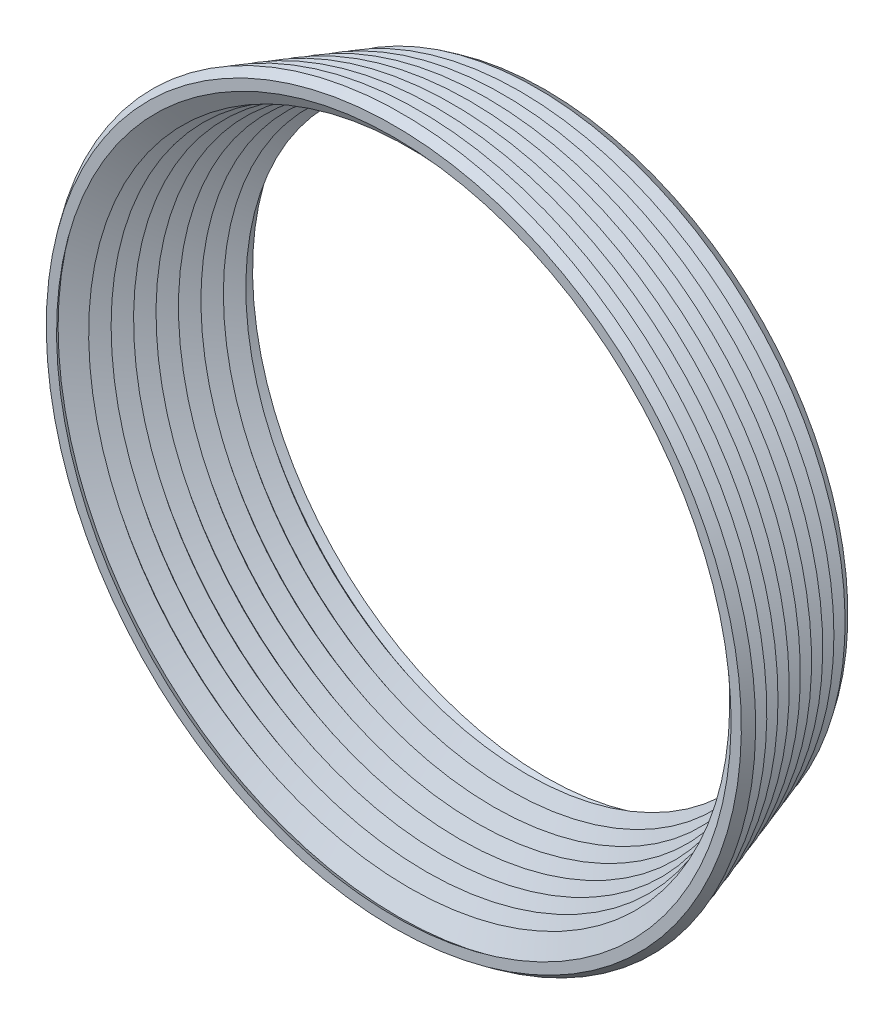
ISO-10303-21;
HEADER;
FILE_DESCRIPTION(('STEP AP214'),'2;1');
FILE_NAME('part.step','',(''),(''),'','','');
FILE_SCHEMA(('AUTOMOTIVE_DESIGN { 1 0 10303 214 1 1 1 1 }'));
ENDSEC;
DATA;
#1=APPLICATION_CONTEXT('core data for automotive mechanical design processes');
#2=APPLICATION_PROTOCOL_DEFINITION('international standard','automotive_design',2000,#1);
#3=PRODUCT_CONTEXT('',#1,'mechanical');
#4=PRODUCT('Part','Part','',(#3));
#5=PRODUCT_RELATED_PRODUCT_CATEGORY('part','',(#4));
#6=PRODUCT_DEFINITION_FORMATION('','',#4);
#7=PRODUCT_DEFINITION_CONTEXT('part definition',#1,'design');
#8=PRODUCT_DEFINITION('design','',#6,#7);
#9=PRODUCT_DEFINITION_SHAPE('','',#8);
#10=(LENGTH_UNIT() NAMED_UNIT(*) SI_UNIT(.MILLI.,.METRE.));
#11=(NAMED_UNIT(*) PLANE_ANGLE_UNIT() SI_UNIT($,.RADIAN.));
#12=(NAMED_UNIT(*) SI_UNIT($,.STERADIAN.) SOLID_ANGLE_UNIT());
#13=UNCERTAINTY_MEASURE_WITH_UNIT(LENGTH_MEASURE(1.E-05),#10,'distance_accuracy_value','');
#14=(GEOMETRIC_REPRESENTATION_CONTEXT(3) GLOBAL_UNCERTAINTY_ASSIGNED_CONTEXT((#13)) GLOBAL_UNIT_ASSIGNED_CONTEXT((#10,
#11,#12)) REPRESENTATION_CONTEXT('',''));
#15=CARTESIAN_POINT('',(0.,0.,0.));
#16=DIRECTION('',(0.,0.,1.));
#17=DIRECTION('',(1.,0.,0.));
#18=AXIS2_PLACEMENT_3D('',#15,#16,#17);
#19=CARTESIAN_POINT('',(0.,41.33,9.));
#20=DIRECTION('',(0.,0.,-1.));
#21=DIRECTION('',(0.,1.,0.));
#22=AXIS2_PLACEMENT_3D('',#19,#20,#21);
#23=PLANE('',#22);
#24=CARTESIAN_POINT('',(0.,0.,9.));
#25=DIRECTION('',(0.,0.,-1.));
#26=DIRECTION('',(0.,1.,0.));
#27=AXIS2_PLACEMENT_3D('',#24,#25,#26);
#28=CIRCLE('',#27,40.1093444384266);
#29=CARTESIAN_POINT('',(0.,40.1093444384266,9.));
#30=VERTEX_POINT('',#29);
#31=EDGE_CURVE('E95',#30,#30,#28,.F.);
#32=ORIENTED_EDGE('',*,*,#31,.F.);
#33=EDGE_LOOP('',(#32));
#34=FACE_BOUND('',#33,.T.);
#35=CARTESIAN_POINT('',(0.,0.,8.99999999999999));
#36=DIRECTION('',(0.,0.,1.));
#37=DIRECTION('',(0.,-1.,0.));
#38=AXIS2_PLACEMENT_3D('',#35,#36,#37);
#39=CIRCLE('',#38,41.33);
#40=CARTESIAN_POINT('',(0.,-41.33,8.99999999999999));
#41=VERTEX_POINT('',#40);
#42=EDGE_CURVE('E10',#41,#41,#39,.T.);
#43=ORIENTED_EDGE('',*,*,#42,.T.);
#44=EDGE_LOOP('',(#43));
#45=FACE_BOUND('',#44,.T.);
#46=ADVANCED_FACE('F31',(#34,#45),#23,.F.);
#47=CARTESIAN_POINT('',(0.,0.,7.99999999999999));
#48=DIRECTION('',(0.,0.,-1.));
#49=DIRECTION('',(0.,1.,0.));
#50=AXIS2_PLACEMENT_3D('',#47,#48,#49);
#51=CONICAL_SURFACE('',#50,42.03,0.61072596438919);
#52=ORIENTED_EDGE('',*,*,#42,.F.);
#53=EDGE_LOOP('',(#52));
#54=FACE_BOUND('',#53,.T.);
#55=CARTESIAN_POINT('',(0.,0.,7.99999999999999));
#56=DIRECTION('',(0.,0.,1.));
#57=DIRECTION('',(0.,-1.,0.));
#58=AXIS2_PLACEMENT_3D('',#55,#56,#57);
#59=CIRCLE('',#58,42.03);
#60=CARTESIAN_POINT('',(0.,-42.03,7.99999999999999));
#61=VERTEX_POINT('',#60);
#62=EDGE_CURVE('E37',#61,#61,#59,.T.);
#63=ORIENTED_EDGE('',*,*,#62,.T.);
#64=EDGE_LOOP('',(#63));
#65=FACE_BOUND('',#64,.T.);
#66=ADVANCED_FACE('F171',(#54,#65),#51,.T.);
#67=CARTESIAN_POINT('',(0.,0.,6.99999999999999));
#68=DIRECTION('',(0.,0.,1.));
#69=DIRECTION('',(0.,-1.,0.));
#70=AXIS2_PLACEMENT_3D('',#67,#68,#69);
#71=CONICAL_SURFACE('',#70,40.02,1.10914074703168);
#72=ORIENTED_EDGE('',*,*,#62,.F.);
#73=EDGE_LOOP('',(#72));
#74=FACE_BOUND('',#73,.T.);
#75=CARTESIAN_POINT('',(0.,0.,6.99999999999999));
#76=DIRECTION('',(0.,0.,1.));
#77=DIRECTION('',(0.,-1.,0.));
#78=AXIS2_PLACEMENT_3D('',#75,#76,#77);
#79=CIRCLE('',#78,40.02);
#80=CARTESIAN_POINT('',(0.,-40.02,6.99999999999999));
#81=VERTEX_POINT('',#80);
#82=EDGE_CURVE('E41',#81,#81,#79,.T.);
#83=ORIENTED_EDGE('',*,*,#82,.T.);
#84=EDGE_LOOP('',(#83));
#85=FACE_BOUND('',#84,.T.);
#86=ADVANCED_FACE('F176',(#74,#85),#71,.T.);
#87=CARTESIAN_POINT('',(0.,0.,5.99999999999999));
#88=DIRECTION('',(0.,0.,-1.));
#89=DIRECTION('',(0.,1.,0.));
#90=AXIS2_PLACEMENT_3D('',#87,#88,#89);
#91=CONICAL_SURFACE('',#90,41.36,0.929687557935191);
#92=ORIENTED_EDGE('',*,*,#82,.F.);
#93=EDGE_LOOP('',(#92));
#94=FACE_BOUND('',#93,.T.);
#95=CARTESIAN_POINT('',(0.,0.,5.99999999999999));
#96=DIRECTION('',(0.,0.,1.));
#97=DIRECTION('',(0.,-1.,0.));
#98=AXIS2_PLACEMENT_3D('',#95,#96,#97);
#99=CIRCLE('',#98,41.36);
#100=CARTESIAN_POINT('',(0.,-41.36,5.99999999999998));
#101=VERTEX_POINT('',#100);
#102=EDGE_CURVE('E45',#101,#101,#99,.T.);
#103=ORIENTED_EDGE('',*,*,#102,.T.);
#104=EDGE_LOOP('',(#103));
#105=FACE_BOUND('',#104,.T.);
#106=ADVANCED_FACE('F182',(#94,#105),#91,.T.);
#107=CARTESIAN_POINT('',(0.,0.,4.99999999999999));
#108=DIRECTION('',(0.,0.,1.));
#109=DIRECTION('',(0.,-1.,0.));
#110=AXIS2_PLACEMENT_3D('',#107,#108,#109);
#111=CONICAL_SURFACE('',#110,39.35,1.10914074703169);
#112=ORIENTED_EDGE('',*,*,#102,.F.);
#113=EDGE_LOOP('',(#112));
#114=FACE_BOUND('',#113,.T.);
#115=CARTESIAN_POINT('',(0.,0.,4.99999999999999));
#116=DIRECTION('',(0.,0.,1.));
#117=DIRECTION('',(0.,-1.,0.));
#118=AXIS2_PLACEMENT_3D('',#115,#116,#117);
#119=CIRCLE('',#118,39.35);
#120=CARTESIAN_POINT('',(0.,-39.35,4.99999999999999));
#121=VERTEX_POINT('',#120);
#122=EDGE_CURVE('E50',#121,#121,#119,.T.);
#123=ORIENTED_EDGE('',*,*,#122,.T.);
#124=EDGE_LOOP('',(#123));
#125=FACE_BOUND('',#124,.T.);
#126=ADVANCED_FACE('F188',(#114,#125),#111,.T.);
#127=CARTESIAN_POINT('',(0.,0.,3.99999999999999));
#128=DIRECTION('',(0.,0.,-1.));
#129=DIRECTION('',(0.,1.,0.));
#130=AXIS2_PLACEMENT_3D('',#127,#128,#129);
#131=CONICAL_SURFACE('',#130,40.69,0.929687557935191);
#132=ORIENTED_EDGE('',*,*,#122,.F.);
#133=EDGE_LOOP('',(#132));
#134=FACE_BOUND('',#133,.T.);
#135=CARTESIAN_POINT('',(0.,0.,3.99999999999999));
#136=DIRECTION('',(0.,0.,1.));
#137=DIRECTION('',(0.,-1.,0.));
#138=AXIS2_PLACEMENT_3D('',#135,#136,#137);
#139=CIRCLE('',#138,40.69);
#140=CARTESIAN_POINT('',(0.,-40.69,3.99999999999998));
#141=VERTEX_POINT('',#140);
#142=EDGE_CURVE('E53',#141,#141,#139,.T.);
#143=ORIENTED_EDGE('',*,*,#142,.T.);
#144=EDGE_LOOP('',(#143));
#145=FACE_BOUND('',#144,.T.);
#146=ADVANCED_FACE('F192',(#134,#145),#131,.T.);
#147=CARTESIAN_POINT('',(0.,0.,2.99999999999999));
#148=DIRECTION('',(0.,0.,1.));
#149=DIRECTION('',(0.,-1.,0.));
#150=AXIS2_PLACEMENT_3D('',#147,#148,#149);
#151=CONICAL_SURFACE('',#150,38.68,1.10914074703168);
#152=ORIENTED_EDGE('',*,*,#142,.F.);
#153=EDGE_LOOP('',(#152));
#154=FACE_BOUND('',#153,.T.);
#155=CARTESIAN_POINT('',(0.,0.,2.99999999999999));
#156=DIRECTION('',(0.,0.,1.));
#157=DIRECTION('',(0.,-1.,0.));
#158=AXIS2_PLACEMENT_3D('',#155,#156,#157);
#159=CIRCLE('',#158,38.68);
#160=CARTESIAN_POINT('',(0.,-38.68,2.99999999999998));
#161=VERTEX_POINT('',#160);
#162=EDGE_CURVE('E56',#161,#161,#159,.T.);
#163=ORIENTED_EDGE('',*,*,#162,.T.);
#164=EDGE_LOOP('',(#163));
#165=FACE_BOUND('',#164,.T.);
#166=ADVANCED_FACE('F196',(#154,#165),#151,.T.);
#167=CARTESIAN_POINT('',(0.,0.,1.99999999999999));
#168=DIRECTION('',(0.,0.,-1.));
#169=DIRECTION('',(0.,1.,0.));
#170=AXIS2_PLACEMENT_3D('',#167,#168,#169);
#171=CONICAL_SURFACE('',#170,40.02,0.929687557935192);
#172=ORIENTED_EDGE('',*,*,#162,.F.);
#173=EDGE_LOOP('',(#172));
#174=FACE_BOUND('',#173,.T.);
#175=CARTESIAN_POINT('',(0.,0.,1.99999999999999));
#176=DIRECTION('',(0.,0.,1.));
#177=DIRECTION('',(0.,-1.,0.));
#178=AXIS2_PLACEMENT_3D('',#175,#176,#177);
#179=CIRCLE('',#178,40.02);
#180=CARTESIAN_POINT('',(0.,-40.02,1.99999999999998));
#181=VERTEX_POINT('',#180);
#182=EDGE_CURVE('E59',#181,#181,#179,.T.);
#183=ORIENTED_EDGE('',*,*,#182,.T.);
#184=EDGE_LOOP('',(#183));
#185=FACE_BOUND('',#184,.T.);
#186=ADVANCED_FACE('F200',(#174,#185),#171,.T.);
#187=CARTESIAN_POINT('',(0.,0.,0.99999999999999));
#188=DIRECTION('',(0.,0.,1.));
#189=DIRECTION('',(0.,-1.,0.));
#190=AXIS2_PLACEMENT_3D('',#187,#188,#189);
#191=CONICAL_SURFACE('',#190,38.01,1.10914074703168);
#192=ORIENTED_EDGE('',*,*,#182,.F.);
#193=EDGE_LOOP('',(#192));
#194=FACE_BOUND('',#193,.T.);
#195=CARTESIAN_POINT('',(0.,0.,0.99999999999999));
#196=DIRECTION('',(0.,0.,1.));
#197=DIRECTION('',(0.,-1.,0.));
#198=AXIS2_PLACEMENT_3D('',#195,#196,#197);
#199=CIRCLE('',#198,38.01);
#200=CARTESIAN_POINT('',(0.,-38.01,0.999999999999984));
#201=VERTEX_POINT('',#200);
#202=EDGE_CURVE('E62',#201,#201,#199,.T.);
#203=ORIENTED_EDGE('',*,*,#202,.T.);
#204=EDGE_LOOP('',(#203));
#205=FACE_BOUND('',#204,.T.);
#206=ADVANCED_FACE('F204',(#194,#205),#191,.T.);
#207=CARTESIAN_POINT('',(0.,0.,0.));
#208=DIRECTION('',(0.,0.,-1.));
#209=DIRECTION('',(0.,1.,0.));
#210=AXIS2_PLACEMENT_3D('',#207,#208,#209);
#211=CONICAL_SURFACE('',#210,39.35,0.929687557935192);
#212=ORIENTED_EDGE('',*,*,#202,.F.);
#213=EDGE_LOOP('',(#212));
#214=FACE_BOUND('',#213,.T.);
#215=CARTESIAN_POINT('',(0.,0.,0.));
#216=DIRECTION('',(0.,0.,1.));
#217=DIRECTION('',(0.,-1.,0.));
#218=AXIS2_PLACEMENT_3D('',#215,#216,#217);
#219=CIRCLE('',#218,39.35);
#220=CARTESIAN_POINT('',(0.,-39.35,0.));
#221=VERTEX_POINT('',#220);
#222=EDGE_CURVE('E65',#221,#221,#219,.T.);
#223=ORIENTED_EDGE('',*,*,#222,.T.);
#224=EDGE_LOOP('',(#223));
#225=FACE_BOUND('',#224,.T.);
#226=ADVANCED_FACE('F208',(#214,#225),#211,.T.);
#227=CARTESIAN_POINT('',(0.,0.,-1.00000000000001));
#228=DIRECTION('',(0.,0.,1.));
#229=DIRECTION('',(0.,-1.,0.));
#230=AXIS2_PLACEMENT_3D('',#227,#228,#229);
#231=CONICAL_SURFACE('',#230,37.34,1.10914074703168);
#232=ORIENTED_EDGE('',*,*,#222,.F.);
#233=EDGE_LOOP('',(#232));
#234=FACE_BOUND('',#233,.T.);
#235=CARTESIAN_POINT('',(0.,0.,-1.00000000000001));
#236=DIRECTION('',(0.,0.,1.));
#237=DIRECTION('',(0.,-1.,0.));
#238=AXIS2_PLACEMENT_3D('',#235,#236,#237);
#239=CIRCLE('',#238,37.34);
#240=CARTESIAN_POINT('',(0.,-37.34,-1.00000000000002));
#241=VERTEX_POINT('',#240);
#242=EDGE_CURVE('E68',#241,#241,#239,.T.);
#243=ORIENTED_EDGE('',*,*,#242,.T.);
#244=EDGE_LOOP('',(#243));
#245=FACE_BOUND('',#244,.T.);
#246=ADVANCED_FACE('F212',(#234,#245),#231,.T.);
#247=CARTESIAN_POINT('',(0.,0.,-2.00000000000001));
#248=DIRECTION('',(0.,0.,-1.));
#249=DIRECTION('',(0.,1.,0.));
#250=AXIS2_PLACEMENT_3D('',#247,#248,#249);
#251=CONICAL_SURFACE('',#250,38.68,0.929687557935192);
#252=ORIENTED_EDGE('',*,*,#242,.F.);
#253=EDGE_LOOP('',(#252));
#254=FACE_BOUND('',#253,.T.);
#255=CARTESIAN_POINT('',(0.,0.,-2.00000000000001));
#256=DIRECTION('',(0.,0.,1.));
#257=DIRECTION('',(0.,-1.,0.));
#258=AXIS2_PLACEMENT_3D('',#255,#256,#257);
#259=CIRCLE('',#258,38.68);
#260=CARTESIAN_POINT('',(0.,-38.68,-2.00000000000002));
#261=VERTEX_POINT('',#260);
#262=EDGE_CURVE('E71',#261,#261,#259,.T.);
#263=ORIENTED_EDGE('',*,*,#262,.T.);
#264=EDGE_LOOP('',(#263));
#265=FACE_BOUND('',#264,.T.);
#266=ADVANCED_FACE('F216',(#254,#265),#251,.T.);
#267=CARTESIAN_POINT('',(0.,0.,-3.00000000000001));
#268=DIRECTION('',(0.,0.,1.));
#269=DIRECTION('',(0.,-1.,0.));
#270=AXIS2_PLACEMENT_3D('',#267,#268,#269);
#271=CONICAL_SURFACE('',#270,36.67,1.10914074703169);
#272=ORIENTED_EDGE('',*,*,#262,.F.);
#273=EDGE_LOOP('',(#272));
#274=FACE_BOUND('',#273,.T.);
#275=CARTESIAN_POINT('',(0.,0.,-3.00000000000001));
#276=DIRECTION('',(0.,0.,1.));
#277=DIRECTION('',(0.,-1.,0.));
#278=AXIS2_PLACEMENT_3D('',#275,#276,#277);
#279=CIRCLE('',#278,36.67);
#280=CARTESIAN_POINT('',(0.,-36.67,-3.00000000000001));
#281=VERTEX_POINT('',#280);
#282=EDGE_CURVE('E74',#281,#281,#279,.T.);
#283=ORIENTED_EDGE('',*,*,#282,.T.);
#284=EDGE_LOOP('',(#283));
#285=FACE_BOUND('',#284,.T.);
#286=ADVANCED_FACE('F220',(#274,#285),#271,.T.);
#287=CARTESIAN_POINT('',(0.,0.,-4.00000000000001));
#288=DIRECTION('',(0.,0.,-1.));
#289=DIRECTION('',(0.,1.,0.));
#290=AXIS2_PLACEMENT_3D('',#287,#288,#289);
#291=CONICAL_SURFACE('',#290,38.01,0.929687557935191);
#292=ORIENTED_EDGE('',*,*,#282,.F.);
#293=EDGE_LOOP('',(#292));
#294=FACE_BOUND('',#293,.T.);
#295=CARTESIAN_POINT('',(0.,0.,-4.00000000000001));
#296=DIRECTION('',(0.,0.,1.));
#297=DIRECTION('',(0.,-1.,0.));
#298=AXIS2_PLACEMENT_3D('',#295,#296,#297);
#299=CIRCLE('',#298,38.01);
#300=CARTESIAN_POINT('',(0.,-38.01,-4.00000000000002));
#301=VERTEX_POINT('',#300);
#302=EDGE_CURVE('E77',#301,#301,#299,.T.);
#303=ORIENTED_EDGE('',*,*,#302,.T.);
#304=EDGE_LOOP('',(#303));
#305=FACE_BOUND('',#304,.T.);
#306=ADVANCED_FACE('F224',(#294,#305),#291,.T.);
#307=CARTESIAN_POINT('',(0.,0.,-5.00000000000001));
#308=DIRECTION('',(0.,0.,1.));
#309=DIRECTION('',(0.,-1.,0.));
#310=AXIS2_PLACEMENT_3D('',#307,#308,#309);
#311=CONICAL_SURFACE('',#310,36.,1.10914074703169);
#312=ORIENTED_EDGE('',*,*,#302,.F.);
#313=EDGE_LOOP('',(#312));
#314=FACE_BOUND('',#313,.T.);
#315=CARTESIAN_POINT('',(0.,0.,-5.00000000000001));
#316=DIRECTION('',(0.,0.,1.));
#317=DIRECTION('',(0.,-1.,0.));
#318=AXIS2_PLACEMENT_3D('',#315,#316,#317);
#319=CIRCLE('',#318,36.);
#320=CARTESIAN_POINT('',(0.,-36.,-5.00000000000002));
#321=VERTEX_POINT('',#320);
#322=EDGE_CURVE('E80',#321,#321,#319,.T.);
#323=ORIENTED_EDGE('',*,*,#322,.T.);
#324=EDGE_LOOP('',(#323));
#325=FACE_BOUND('',#324,.T.);
#326=ADVANCED_FACE('F228',(#314,#325),#311,.T.);
#327=CARTESIAN_POINT('',(0.,0.,-6.00000000000001));
#328=DIRECTION('',(0.,0.,-1.));
#329=DIRECTION('',(0.,1.,0.));
#330=AXIS2_PLACEMENT_3D('',#327,#328,#329);
#331=CONICAL_SURFACE('',#330,37.34,0.929687557935191);
#332=ORIENTED_EDGE('',*,*,#322,.F.);
#333=EDGE_LOOP('',(#332));
#334=FACE_BOUND('',#333,.T.);
#335=CARTESIAN_POINT('',(0.,0.,-6.00000000000001));
#336=DIRECTION('',(0.,0.,1.));
#337=DIRECTION('',(0.,-1.,0.));
#338=AXIS2_PLACEMENT_3D('',#335,#336,#337);
#339=CIRCLE('',#338,37.34);
#340=CARTESIAN_POINT('',(0.,-37.34,-6.00000000000002));
#341=VERTEX_POINT('',#340);
#342=EDGE_CURVE('E83',#341,#341,#339,.T.);
#343=ORIENTED_EDGE('',*,*,#342,.T.);
#344=EDGE_LOOP('',(#343));
#345=FACE_BOUND('',#344,.T.);
#346=ADVANCED_FACE('F232',(#334,#345),#331,.T.);
#347=CARTESIAN_POINT('',(0.,0.,-7.00000000000001));
#348=DIRECTION('',(0.,0.,1.));
#349=DIRECTION('',(0.,-1.,0.));
#350=AXIS2_PLACEMENT_3D('',#347,#348,#349);
#351=CONICAL_SURFACE('',#350,35.33,1.10914074703169);
#352=ORIENTED_EDGE('',*,*,#342,.F.);
#353=EDGE_LOOP('',(#352));
#354=FACE_BOUND('',#353,.T.);
#355=CARTESIAN_POINT('',(0.,0.,-7.00000000000001));
#356=DIRECTION('',(0.,0.,1.));
#357=DIRECTION('',(0.,-1.,0.));
#358=AXIS2_PLACEMENT_3D('',#355,#356,#357);
#359=CIRCLE('',#358,35.33);
#360=CARTESIAN_POINT('',(0.,-35.33,-7.00000000000001));
#361=VERTEX_POINT('',#360);
#362=EDGE_CURVE('E86',#361,#361,#359,.T.);
#363=ORIENTED_EDGE('',*,*,#362,.T.);
#364=EDGE_LOOP('',(#363));
#365=FACE_BOUND('',#364,.T.);
#366=ADVANCED_FACE('F236',(#354,#365),#351,.T.);
#367=CARTESIAN_POINT('',(0.,0.,-8.00000000000001));
#368=DIRECTION('',(0.,0.,-1.));
#369=DIRECTION('',(0.,1.,0.));
#370=AXIS2_PLACEMENT_3D('',#367,#368,#369);
#371=CONICAL_SURFACE('',#370,36.67,0.929687557935191);
#372=ORIENTED_EDGE('',*,*,#362,.F.);
#373=EDGE_LOOP('',(#372));
#374=FACE_BOUND('',#373,.T.);
#375=CARTESIAN_POINT('',(0.,0.,-8.00000000000001));
#376=DIRECTION('',(0.,0.,1.));
#377=DIRECTION('',(0.,-1.,0.));
#378=AXIS2_PLACEMENT_3D('',#375,#376,#377);
#379=CIRCLE('',#378,36.67);
#380=CARTESIAN_POINT('',(0.,-36.67,-8.00000000000002));
#381=VERTEX_POINT('',#380);
#382=EDGE_CURVE('E89',#381,#381,#379,.T.);
#383=ORIENTED_EDGE('',*,*,#382,.T.);
#384=EDGE_LOOP('',(#383));
#385=FACE_BOUND('',#384,.T.);
#386=ADVANCED_FACE('F240',(#374,#385),#371,.T.);
#387=CARTESIAN_POINT('',(0.,0.,-9.00000000000001));
#388=DIRECTION('',(0.,0.,1.));
#389=DIRECTION('',(0.,-1.,0.));
#390=AXIS2_PLACEMENT_3D('',#387,#388,#389);
#391=CONICAL_SURFACE('',#390,36.,0.590306746935369);
#392=ORIENTED_EDGE('',*,*,#382,.F.);
#393=EDGE_LOOP('',(#392));
#394=FACE_BOUND('',#393,.T.);
#395=CARTESIAN_POINT('',(0.,0.,-9.00000000000001));
#396=DIRECTION('',(0.,0.,1.));
#397=DIRECTION('',(0.,-1.,0.));
#398=AXIS2_PLACEMENT_3D('',#395,#396,#397);
#399=CIRCLE('',#398,36.);
#400=CARTESIAN_POINT('',(0.,-36.,-9.00000000000002));
#401=VERTEX_POINT('',#400);
#402=EDGE_CURVE('E92',#401,#401,#399,.T.);
#403=ORIENTED_EDGE('',*,*,#402,.T.);
#404=EDGE_LOOP('',(#403));
#405=FACE_BOUND('',#404,.T.);
#406=ADVANCED_FACE('F167',(#394,#405),#391,.T.);
#407=CARTESIAN_POINT('',(0.,36.,-9.));
#408=DIRECTION('',(0.,0.,1.));
#409=DIRECTION('',(0.,-1.,0.));
#410=AXIS2_PLACEMENT_3D('',#407,#408,#409);
#411=PLANE('',#410);
#412=CARTESIAN_POINT('',(0.,0.,-9.00000000000001));
#413=DIRECTION('',(0.,0.,1.));
#414=DIRECTION('',(0.,-1.,0.));
#415=AXIS2_PLACEMENT_3D('',#412,#413,#414);
#416=CIRCLE('',#415,34.7962973789179);
#417=CARTESIAN_POINT('',(0.,-34.7962973789179,-9.00000000000001));
#418=VERTEX_POINT('',#417);
#419=EDGE_CURVE('E96',#418,#418,#416,.T.);
#420=ORIENTED_EDGE('',*,*,#419,.T.);
#421=EDGE_LOOP('',(#420));
#422=FACE_BOUND('',#421,.T.);
#423=ORIENTED_EDGE('',*,*,#402,.F.);
#424=EDGE_LOOP('',(#423));
#425=FACE_BOUND('',#424,.T.);
#426=ADVANCED_FACE('F158',(#422,#425),#411,.F.);
#427=CARTESIAN_POINT('',(0.,0.,7.42653765563668));
#428=DIRECTION('',(0.,0.,-1.));
#429=DIRECTION('',(0.,1.,0.));
#430=AXIS2_PLACEMENT_3D('',#427,#428,#429);
#431=CONICAL_SURFACE('',#430,41.2107680794809,0.61072596438919);
#432=ORIENTED_EDGE('',*,*,#31,.T.);
#433=EDGE_LOOP('',(#432));
#434=FACE_BOUND('',#433,.T.);
#435=CARTESIAN_POINT('',(0.,0.,8.37799304138402));
#436=DIRECTION('',(0.,0.,1.));
#437=DIRECTION('',(0.,-1.,0.));
#438=AXIS2_PLACEMENT_3D('',#435,#436,#437);
#439=CIRCLE('',#438,40.5447493094578);
#440=CARTESIAN_POINT('',(0.,-40.5447493094578,8.37799304138401));
#441=VERTEX_POINT('',#440);
#442=EDGE_CURVE('E102',#441,#441,#439,.T.);
#443=ORIENTED_EDGE('',*,*,#442,.F.);
#444=EDGE_LOOP('',(#443));
#445=FACE_BOUND('',#444,.T.);
#446=ADVANCED_FACE('F156',(#434,#445),#431,.F.);
#447=CARTESIAN_POINT('',(0.,0.,7.89531627834474));
#448=DIRECTION('',(0.,0.,1.));
#449=DIRECTION('',(0.,-1.,0.));
#450=AXIS2_PLACEMENT_3D('',#447,#448,#449);
#451=CONICAL_SURFACE('',#450,39.5745690157489,1.10914074703168);
#452=ORIENTED_EDGE('',*,*,#442,.T.);
#453=EDGE_LOOP('',(#452));
#454=FACE_BOUND('',#453,.T.);
#455=CARTESIAN_POINT('',(0.,0.,7.17104833404235));
#456=DIRECTION('',(0.,0.,1.));
#457=DIRECTION('',(0.,-1.,0.));
#458=AXIS2_PLACEMENT_3D('',#455,#456,#457);
#459=CIRCLE('',#458,38.1187904477011);
#460=CARTESIAN_POINT('',(0.,-38.1187904477011,7.17104833404234));
#461=VERTEX_POINT('',#460);
#462=EDGE_CURVE('E147',#461,#461,#459,.T.);
#463=ORIENTED_EDGE('',*,*,#462,.F.);
#464=EDGE_LOOP('',(#463));
#465=FACE_BOUND('',#464,.T.);
#466=ADVANCED_FACE('F153',(#454,#465),#451,.F.);
#467=CARTESIAN_POINT('',(0.,0.,5.1985668867241));
#468=DIRECTION('',(0.,0.,-1.));
#469=DIRECTION('',(0.,1.,0.));
#470=AXIS2_PLACEMENT_3D('',#467,#468,#469);
#471=CONICAL_SURFACE('',#470,40.7619155871075,0.929687557935191);
#472=ORIENTED_EDGE('',*,*,#462,.T.);
#473=EDGE_LOOP('',(#472));
#474=FACE_BOUND('',#473,.T.);
#475=CARTESIAN_POINT('',(0.,0.,6.17104833404235));
#476=DIRECTION('',(0.,0.,1.));
#477=DIRECTION('',(0.,-1.,0.));
#478=AXIS2_PLACEMENT_3D('',#475,#476,#477);
#479=CIRCLE('',#478,39.4587904477011);
#480=CARTESIAN_POINT('',(0.,-39.4587904477011,6.17104833404234));
#481=VERTEX_POINT('',#480);
#482=EDGE_CURVE('E144',#481,#481,#479,.T.);
#483=ORIENTED_EDGE('',*,*,#482,.F.);
#484=EDGE_LOOP('',(#483));
#485=FACE_BOUND('',#484,.T.);
#486=ADVANCED_FACE('F165',(#474,#485),#471,.F.);
#487=CARTESIAN_POINT('',(0.,0.,5.89531627834474));
#488=DIRECTION('',(0.,0.,1.));
#489=DIRECTION('',(0.,-1.,0.));
#490=AXIS2_PLACEMENT_3D('',#487,#488,#489);
#491=CONICAL_SURFACE('',#490,38.9045690157489,1.10914074703169);
#492=ORIENTED_EDGE('',*,*,#482,.T.);
#493=EDGE_LOOP('',(#492));
#494=FACE_BOUND('',#493,.T.);
#495=CARTESIAN_POINT('',(0.,0.,5.17104833404235));
#496=DIRECTION('',(0.,0.,1.));
#497=DIRECTION('',(0.,-1.,0.));
#498=AXIS2_PLACEMENT_3D('',#495,#496,#497);
#499=CIRCLE('',#498,37.4487904477011);
#500=CARTESIAN_POINT('',(0.,-37.4487904477011,5.17104833404234));
#501=VERTEX_POINT('',#500);
#502=EDGE_CURVE('E141',#501,#501,#499,.T.);
#503=ORIENTED_EDGE('',*,*,#502,.F.);
#504=EDGE_LOOP('',(#503));
#505=FACE_BOUND('',#504,.T.);
#506=ADVANCED_FACE('F303',(#494,#505),#491,.F.);
#507=CARTESIAN_POINT('',(0.,0.,3.1985668867241));
#508=DIRECTION('',(0.,0.,-1.));
#509=DIRECTION('',(0.,1.,0.));
#510=AXIS2_PLACEMENT_3D('',#507,#508,#509);
#511=CONICAL_SURFACE('',#510,40.0919155871075,0.929687557935191);
#512=ORIENTED_EDGE('',*,*,#502,.T.);
#513=EDGE_LOOP('',(#512));
#514=FACE_BOUND('',#513,.T.);
#515=CARTESIAN_POINT('',(0.,0.,4.17104833404235));
#516=DIRECTION('',(0.,0.,1.));
#517=DIRECTION('',(0.,-1.,0.));
#518=AXIS2_PLACEMENT_3D('',#515,#516,#517);
#519=CIRCLE('',#518,38.7887904477011);
#520=CARTESIAN_POINT('',(0.,-38.7887904477011,4.17104833404234));
#521=VERTEX_POINT('',#520);
#522=EDGE_CURVE('E138',#521,#521,#519,.T.);
#523=ORIENTED_EDGE('',*,*,#522,.F.);
#524=EDGE_LOOP('',(#523));
#525=FACE_BOUND('',#524,.T.);
#526=ADVANCED_FACE('F299',(#514,#525),#511,.F.);
#527=CARTESIAN_POINT('',(0.,0.,3.89531627834473));
#528=DIRECTION('',(0.,0.,1.));
#529=DIRECTION('',(0.,-1.,0.));
#530=AXIS2_PLACEMENT_3D('',#527,#528,#529);
#531=CONICAL_SURFACE('',#530,38.2345690157489,1.10914074703168);
#532=ORIENTED_EDGE('',*,*,#522,.T.);
#533=EDGE_LOOP('',(#532));
#534=FACE_BOUND('',#533,.T.);
#535=CARTESIAN_POINT('',(0.,0.,3.17104833404235));
#536=DIRECTION('',(0.,0.,1.));
#537=DIRECTION('',(0.,-1.,0.));
#538=AXIS2_PLACEMENT_3D('',#535,#536,#537);
#539=CIRCLE('',#538,36.7787904477011);
#540=CARTESIAN_POINT('',(0.,-36.7787904477011,3.17104833404234));
#541=VERTEX_POINT('',#540);
#542=EDGE_CURVE('E135',#541,#541,#539,.T.);
#543=ORIENTED_EDGE('',*,*,#542,.F.);
#544=EDGE_LOOP('',(#543));
#545=FACE_BOUND('',#544,.T.);
#546=ADVANCED_FACE('F295',(#534,#545),#531,.F.);
#547=CARTESIAN_POINT('',(0.,0.,1.1985668867241));
#548=DIRECTION('',(0.,0.,-1.));
#549=DIRECTION('',(0.,1.,0.));
#550=AXIS2_PLACEMENT_3D('',#547,#548,#549);
#551=CONICAL_SURFACE('',#550,39.4219155871075,0.929687557935192);
#552=ORIENTED_EDGE('',*,*,#542,.T.);
#553=EDGE_LOOP('',(#552));
#554=FACE_BOUND('',#553,.T.);
#555=CARTESIAN_POINT('',(0.,0.,2.17104833404235));
#556=DIRECTION('',(0.,0.,1.));
#557=DIRECTION('',(0.,-1.,0.));
#558=AXIS2_PLACEMENT_3D('',#555,#556,#557);
#559=CIRCLE('',#558,38.1187904477011);
#560=CARTESIAN_POINT('',(0.,-38.1187904477011,2.17104833404234));
#561=VERTEX_POINT('',#560);
#562=EDGE_CURVE('E132',#561,#561,#559,.T.);
#563=ORIENTED_EDGE('',*,*,#562,.F.);
#564=EDGE_LOOP('',(#563));
#565=FACE_BOUND('',#564,.T.);
#566=ADVANCED_FACE('F291',(#554,#565),#551,.F.);
#567=CARTESIAN_POINT('',(0.,0.,1.89531627834473));
#568=DIRECTION('',(0.,0.,1.));
#569=DIRECTION('',(0.,-1.,0.));
#570=AXIS2_PLACEMENT_3D('',#567,#568,#569);
#571=CONICAL_SURFACE('',#570,37.5645690157489,1.10914074703168);
#572=ORIENTED_EDGE('',*,*,#562,.T.);
#573=EDGE_LOOP('',(#572));
#574=FACE_BOUND('',#573,.T.);
#575=CARTESIAN_POINT('',(0.,0.,1.17104833404235));
#576=DIRECTION('',(0.,0.,1.));
#577=DIRECTION('',(0.,-1.,0.));
#578=AXIS2_PLACEMENT_3D('',#575,#576,#577);
#579=CIRCLE('',#578,36.1087904477011);
#580=CARTESIAN_POINT('',(0.,-36.1087904477011,1.17104833404234));
#581=VERTEX_POINT('',#580);
#582=EDGE_CURVE('E129',#581,#581,#579,.T.);
#583=ORIENTED_EDGE('',*,*,#582,.F.);
#584=EDGE_LOOP('',(#583));
#585=FACE_BOUND('',#584,.T.);
#586=ADVANCED_FACE('F287',(#574,#585),#571,.F.);
#587=CARTESIAN_POINT('',(0.,0.,-0.8014331132759));
#588=DIRECTION('',(0.,0.,-1.));
#589=DIRECTION('',(0.,1.,0.));
#590=AXIS2_PLACEMENT_3D('',#587,#588,#589);
#591=CONICAL_SURFACE('',#590,38.7519155871075,0.929687557935192);
#592=ORIENTED_EDGE('',*,*,#582,.T.);
#593=EDGE_LOOP('',(#592));
#594=FACE_BOUND('',#593,.T.);
#595=CARTESIAN_POINT('',(0.,0.,0.171048334042346));
#596=DIRECTION('',(0.,0.,1.));
#597=DIRECTION('',(0.,-1.,0.));
#598=AXIS2_PLACEMENT_3D('',#595,#596,#597);
#599=CIRCLE('',#598,37.4487904477011);
#600=CARTESIAN_POINT('',(0.,-37.4487904477011,0.171048334042339));
#601=VERTEX_POINT('',#600);
#602=EDGE_CURVE('E126',#601,#601,#599,.T.);
#603=ORIENTED_EDGE('',*,*,#602,.F.);
#604=EDGE_LOOP('',(#603));
#605=FACE_BOUND('',#604,.T.);
#606=ADVANCED_FACE('F283',(#594,#605),#591,.F.);
#607=CARTESIAN_POINT('',(0.,0.,-0.104683721655267));
#608=DIRECTION('',(0.,0.,1.));
#609=DIRECTION('',(0.,-1.,0.));
#610=AXIS2_PLACEMENT_3D('',#607,#608,#609);
#611=CONICAL_SURFACE('',#610,36.8945690157489,1.10914074703168);
#612=ORIENTED_EDGE('',*,*,#602,.T.);
#613=EDGE_LOOP('',(#612));
#614=FACE_BOUND('',#613,.T.);
#615=CARTESIAN_POINT('',(0.,0.,-0.828951665957655));
#616=DIRECTION('',(0.,0.,1.));
#617=DIRECTION('',(0.,-1.,0.));
#618=AXIS2_PLACEMENT_3D('',#615,#616,#617);
#619=CIRCLE('',#618,35.4387904477011);
#620=CARTESIAN_POINT('',(0.,-35.4387904477011,-0.828951665957661));
#621=VERTEX_POINT('',#620);
#622=EDGE_CURVE('E123',#621,#621,#619,.T.);
#623=ORIENTED_EDGE('',*,*,#622,.F.);
#624=EDGE_LOOP('',(#623));
#625=FACE_BOUND('',#624,.T.);
#626=ADVANCED_FACE('F279',(#614,#625),#611,.F.);
#627=CARTESIAN_POINT('',(0.,0.,-2.8014331132759));
#628=DIRECTION('',(0.,0.,-1.));
#629=DIRECTION('',(0.,1.,0.));
#630=AXIS2_PLACEMENT_3D('',#627,#628,#629);
#631=CONICAL_SURFACE('',#630,38.0819155871075,0.929687557935192);
#632=ORIENTED_EDGE('',*,*,#622,.T.);
#633=EDGE_LOOP('',(#632));
#634=FACE_BOUND('',#633,.T.);
#635=CARTESIAN_POINT('',(0.,0.,-1.82895166595765));
#636=DIRECTION('',(0.,0.,1.));
#637=DIRECTION('',(0.,-1.,0.));
#638=AXIS2_PLACEMENT_3D('',#635,#636,#637);
#639=CIRCLE('',#638,36.7787904477011);
#640=CARTESIAN_POINT('',(0.,-36.7787904477011,-1.82895166595765));
#641=VERTEX_POINT('',#640);
#642=EDGE_CURVE('E120',#641,#641,#639,.T.);
#643=ORIENTED_EDGE('',*,*,#642,.F.);
#644=EDGE_LOOP('',(#643));
#645=FACE_BOUND('',#644,.T.);
#646=ADVANCED_FACE('F275',(#634,#645),#631,.F.);
#647=CARTESIAN_POINT('',(0.,0.,-2.10468372165526));
#648=DIRECTION('',(0.,0.,1.));
#649=DIRECTION('',(0.,-1.,0.));
#650=AXIS2_PLACEMENT_3D('',#647,#648,#649);
#651=CONICAL_SURFACE('',#650,36.2245690157489,1.10914074703169);
#652=ORIENTED_EDGE('',*,*,#642,.T.);
#653=EDGE_LOOP('',(#652));
#654=FACE_BOUND('',#653,.T.);
#655=CARTESIAN_POINT('',(0.,0.,-2.82895166595764));
#656=DIRECTION('',(0.,0.,1.));
#657=DIRECTION('',(0.,-1.,0.));
#658=AXIS2_PLACEMENT_3D('',#655,#656,#657);
#659=CIRCLE('',#658,34.7687904477011);
#660=CARTESIAN_POINT('',(0.,-34.7687904477011,-2.82895166595765));
#661=VERTEX_POINT('',#660);
#662=EDGE_CURVE('E117',#661,#661,#659,.T.);
#663=ORIENTED_EDGE('',*,*,#662,.F.);
#664=EDGE_LOOP('',(#663));
#665=FACE_BOUND('',#664,.T.);
#666=ADVANCED_FACE('F271',(#654,#665),#651,.F.);
#667=CARTESIAN_POINT('',(0.,0.,-4.8014331132759));
#668=DIRECTION('',(0.,0.,-1.));
#669=DIRECTION('',(0.,1.,0.));
#670=AXIS2_PLACEMENT_3D('',#667,#668,#669);
#671=CONICAL_SURFACE('',#670,37.4119155871075,0.929687557935191);
#672=ORIENTED_EDGE('',*,*,#662,.T.);
#673=EDGE_LOOP('',(#672));
#674=FACE_BOUND('',#673,.T.);
#675=CARTESIAN_POINT('',(0.,0.,-3.82895166595765));
#676=DIRECTION('',(0.,0.,1.));
#677=DIRECTION('',(0.,-1.,0.));
#678=AXIS2_PLACEMENT_3D('',#675,#676,#677);
#679=CIRCLE('',#678,36.1087904477011);
#680=CARTESIAN_POINT('',(0.,-36.1087904477011,-3.82895166595765));
#681=VERTEX_POINT('',#680);
#682=EDGE_CURVE('E114',#681,#681,#679,.T.);
#683=ORIENTED_EDGE('',*,*,#682,.F.);
#684=EDGE_LOOP('',(#683));
#685=FACE_BOUND('',#684,.T.);
#686=ADVANCED_FACE('F267',(#674,#685),#671,.F.);
#687=CARTESIAN_POINT('',(0.,0.,-4.10468372165526));
#688=DIRECTION('',(0.,0.,1.));
#689=DIRECTION('',(0.,-1.,0.));
#690=AXIS2_PLACEMENT_3D('',#687,#688,#689);
#691=CONICAL_SURFACE('',#690,35.5545690157489,1.10914074703169);
#692=ORIENTED_EDGE('',*,*,#682,.T.);
#693=EDGE_LOOP('',(#692));
#694=FACE_BOUND('',#693,.T.);
#695=CARTESIAN_POINT('',(0.,0.,-4.82895166595765));
#696=DIRECTION('',(0.,0.,1.));
#697=DIRECTION('',(0.,-1.,0.));
#698=AXIS2_PLACEMENT_3D('',#695,#696,#697);
#699=CIRCLE('',#698,34.0987904477011);
#700=CARTESIAN_POINT('',(0.,-34.0987904477011,-4.82895166595765));
#701=VERTEX_POINT('',#700);
#702=EDGE_CURVE('E111',#701,#701,#699,.T.);
#703=ORIENTED_EDGE('',*,*,#702,.F.);
#704=EDGE_LOOP('',(#703));
#705=FACE_BOUND('',#704,.T.);
#706=ADVANCED_FACE('F263',(#694,#705),#691,.F.);
#707=CARTESIAN_POINT('',(0.,0.,-6.8014331132759));
#708=DIRECTION('',(0.,0.,-1.));
#709=DIRECTION('',(0.,1.,0.));
#710=AXIS2_PLACEMENT_3D('',#707,#708,#709);
#711=CONICAL_SURFACE('',#710,36.7419155871075,0.929687557935191);
#712=ORIENTED_EDGE('',*,*,#702,.T.);
#713=EDGE_LOOP('',(#712));
#714=FACE_BOUND('',#713,.T.);
#715=CARTESIAN_POINT('',(0.,0.,-5.82895166595765));
#716=DIRECTION('',(0.,0.,1.));
#717=DIRECTION('',(0.,-1.,0.));
#718=AXIS2_PLACEMENT_3D('',#715,#716,#717);
#719=CIRCLE('',#718,35.4387904477011);
#720=CARTESIAN_POINT('',(0.,-35.4387904477011,-5.82895166595766));
#721=VERTEX_POINT('',#720);
#722=EDGE_CURVE('E108',#721,#721,#719,.T.);
#723=ORIENTED_EDGE('',*,*,#722,.F.);
#724=EDGE_LOOP('',(#723));
#725=FACE_BOUND('',#724,.T.);
#726=ADVANCED_FACE('F259',(#714,#725),#711,.F.);
#727=CARTESIAN_POINT('',(0.,0.,-6.10468372165526));
#728=DIRECTION('',(0.,0.,1.));
#729=DIRECTION('',(0.,-1.,0.));
#730=AXIS2_PLACEMENT_3D('',#727,#728,#729);
#731=CONICAL_SURFACE('',#730,34.8845690157489,1.10914074703169);
#732=ORIENTED_EDGE('',*,*,#722,.T.);
#733=EDGE_LOOP('',(#732));
#734=FACE_BOUND('',#733,.T.);
#735=CARTESIAN_POINT('',(0.,0.,-6.82895166595765));
#736=DIRECTION('',(0.,0.,1.));
#737=DIRECTION('',(0.,-1.,0.));
#738=AXIS2_PLACEMENT_3D('',#735,#736,#737);
#739=CIRCLE('',#738,33.4287904477011);
#740=CARTESIAN_POINT('',(0.,-33.4287904477011,-6.82895166595765));
#741=VERTEX_POINT('',#740);
#742=EDGE_CURVE('E105',#741,#741,#739,.T.);
#743=ORIENTED_EDGE('',*,*,#742,.F.);
#744=EDGE_LOOP('',(#743));
#745=FACE_BOUND('',#744,.T.);
#746=ADVANCED_FACE('F255',(#734,#745),#731,.F.);
#747=CARTESIAN_POINT('',(0.,0.,-8.8014331132759));
#748=DIRECTION('',(0.,0.,-1.));
#749=DIRECTION('',(0.,1.,0.));
#750=AXIS2_PLACEMENT_3D('',#747,#748,#749);
#751=CONICAL_SURFACE('',#750,36.0719155871075,0.929687557935191);
#752=ORIENTED_EDGE('',*,*,#742,.T.);
#753=EDGE_LOOP('',(#752));
#754=FACE_BOUND('',#753,.T.);
#755=CARTESIAN_POINT('',(0.,0.,-8.23298615104479));
#756=DIRECTION('',(0.,0.,1.));
#757=DIRECTION('',(0.,-1.,0.));
#758=AXIS2_PLACEMENT_3D('',#755,#756,#757);
#759=CIRCLE('',#758,35.3101966577179);
#760=CARTESIAN_POINT('',(0.,-35.3101966577179,-8.2329861510448));
#761=VERTEX_POINT('',#760);
#762=EDGE_CURVE('E99',#761,#761,#759,.T.);
#763=ORIENTED_EDGE('',*,*,#762,.F.);
#764=EDGE_LOOP('',(#763));
#765=FACE_BOUND('',#764,.T.);
#766=ADVANCED_FACE('F251',(#754,#765),#751,.F.);
#767=CARTESIAN_POINT('',(0.,0.,-8.44338411475946));
#768=DIRECTION('',(0.,0.,1.));
#769=DIRECTION('',(0.,-1.,0.));
#770=AXIS2_PLACEMENT_3D('',#767,#768,#769);
#771=CONICAL_SURFACE('',#770,35.169230022029,0.590306746935369);
#772=ORIENTED_EDGE('',*,*,#762,.T.);
#773=EDGE_LOOP('',(#772));
#774=FACE_BOUND('',#773,.T.);
#775=ORIENTED_EDGE('',*,*,#419,.F.);
#776=EDGE_LOOP('',(#775));
#777=FACE_BOUND('',#776,.T.);
#778=ADVANCED_FACE('F248',(#774,#777),#771,.F.);
#779=CLOSED_SHELL('',(#46,#66,#86,#106,#126,#146,#166,#186,#206,#226,#246,#266,#286,#306,#326,
#346,#366,#386,#406,#426,#446,#466,#486,#506,#526,#546,#566,#586,#606,#626,#646,#666,#686,#706,
#726,#746,#766,#778));
#780=MANIFOLD_SOLID_BREP('B2',#779);
#781=ADVANCED_BREP_SHAPE_REPRESENTATION('',(#18,#780),#14);
#782=SHAPE_DEFINITION_REPRESENTATION(#9,#781);
ENDSEC;
END-ISO-10303-21;
